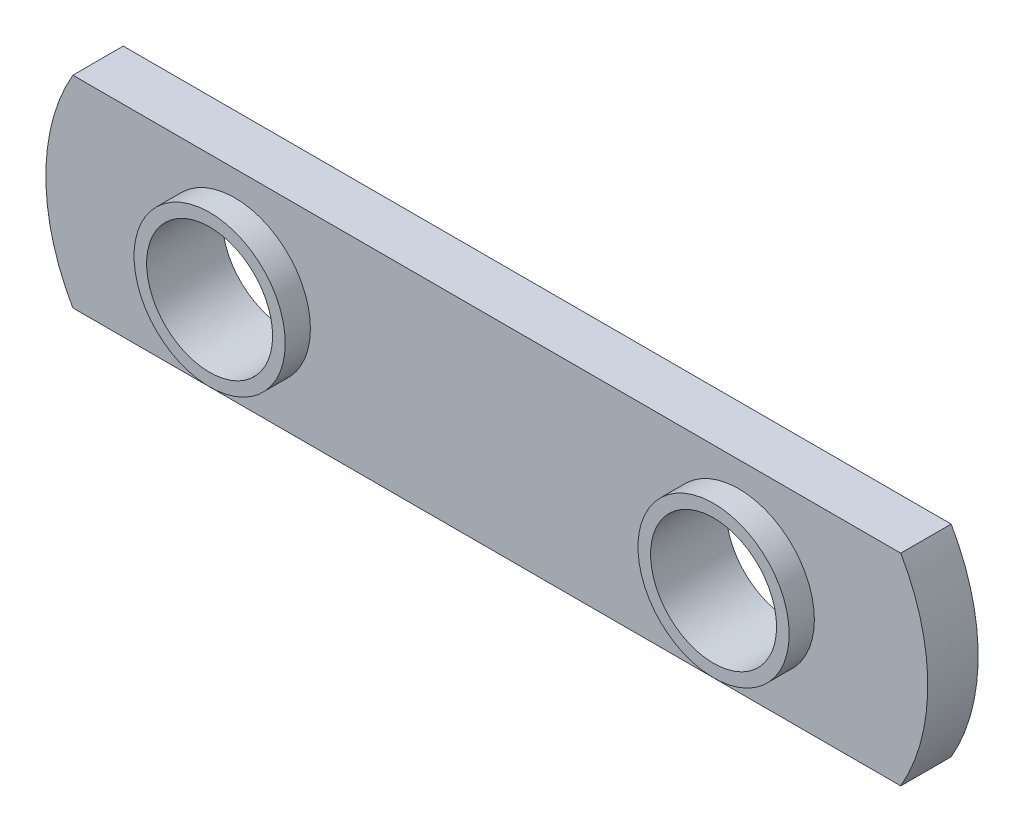
ISO-10303-21;
HEADER;
FILE_DESCRIPTION(('STEP AP214'),'2;1');
FILE_NAME('part.step','',(''),(''),'','','');
FILE_SCHEMA(('AUTOMOTIVE_DESIGN { 1 0 10303 214 1 1 1 1 }'));
ENDSEC;
DATA;
#1=APPLICATION_CONTEXT('core data for automotive mechanical design processes');
#2=APPLICATION_PROTOCOL_DEFINITION('international standard','automotive_design',2000,#1);
#3=PRODUCT_CONTEXT('',#1,'mechanical');
#4=PRODUCT('Part','Part','',(#3));
#5=PRODUCT_RELATED_PRODUCT_CATEGORY('part','',(#4));
#6=PRODUCT_DEFINITION_FORMATION('','',#4);
#7=PRODUCT_DEFINITION_CONTEXT('part definition',#1,'design');
#8=PRODUCT_DEFINITION('design','',#6,#7);
#9=PRODUCT_DEFINITION_SHAPE('','',#8);
#10=(LENGTH_UNIT() NAMED_UNIT(*) SI_UNIT(.MILLI.,.METRE.));
#11=(NAMED_UNIT(*) PLANE_ANGLE_UNIT() SI_UNIT($,.RADIAN.));
#12=(NAMED_UNIT(*) SI_UNIT($,.STERADIAN.) SOLID_ANGLE_UNIT());
#13=UNCERTAINTY_MEASURE_WITH_UNIT(LENGTH_MEASURE(1.E-05),#10,'distance_accuracy_value','');
#14=(GEOMETRIC_REPRESENTATION_CONTEXT(3) GLOBAL_UNCERTAINTY_ASSIGNED_CONTEXT((#13)) GLOBAL_UNIT_ASSIGNED_CONTEXT((#10,
#11,#12)) REPRESENTATION_CONTEXT('',''));
#15=CARTESIAN_POINT('',(0.,0.,0.));
#16=DIRECTION('',(0.,0.,1.));
#17=DIRECTION('',(1.,0.,0.));
#18=AXIS2_PLACEMENT_3D('',#15,#16,#17);
#19=CARTESIAN_POINT('',(13.,0.,1.5));
#20=DIRECTION('',(0.,0.,1.));
#21=DIRECTION('',(1.,0.,0.));
#22=AXIS2_PLACEMENT_3D('',#19,#20,#21);
#23=PLANE('',#22);
#24=CARTESIAN_POINT('',(10.,0.,1.5));
#25=DIRECTION('',(0.,0.,1.));
#26=DIRECTION('',(1.,0.,0.));
#27=AXIS2_PLACEMENT_3D('',#24,#25,#26);
#28=CIRCLE('',#27,2.5);
#29=CARTESIAN_POINT('',(12.5,0.,1.5));
#30=VERTEX_POINT('',#29);
#31=EDGE_CURVE('E57',#30,#30,#28,.T.);
#32=ORIENTED_EDGE('',*,*,#31,.F.);
#33=EDGE_LOOP('',(#32));
#34=FACE_BOUND('',#33,.T.);
#35=CARTESIAN_POINT('',(10.,0.,1.5));
#36=DIRECTION('',(0.,0.,1.));
#37=DIRECTION('',(1.,0.,0.));
#38=AXIS2_PLACEMENT_3D('',#35,#36,#37);
#39=CIRCLE('',#38,3.);
#40=CARTESIAN_POINT('',(13.,0.,1.5));
#41=VERTEX_POINT('',#40);
#42=EDGE_CURVE('E151',#41,#41,#39,.T.);
#43=ORIENTED_EDGE('',*,*,#42,.T.);
#44=EDGE_LOOP('',(#43));
#45=FACE_BOUND('',#44,.T.);
#46=ADVANCED_FACE('F47',(#34,#45),#23,.T.);
#47=CARTESIAN_POINT('',(3.5717967697245,4.00000000000002,-1.5));
#48=DIRECTION('',(0.,0.,-1.));
#49=DIRECTION('',(-1.,0.,0.));
#50=AXIS2_PLACEMENT_3D('',#47,#48,#49);
#51=PLANE('',#50);
#52=CARTESIAN_POINT('',(10.,0.,-1.5));
#53=DIRECTION('',(0.,0.,-1.));
#54=DIRECTION('',(-1.,0.,0.));
#55=AXIS2_PLACEMENT_3D('',#52,#53,#54);
#56=CIRCLE('',#55,2.5);
#57=CARTESIAN_POINT('',(7.50000000000001,0.,-1.5));
#58=VERTEX_POINT('',#57);
#59=EDGE_CURVE('E12',#58,#58,#56,.T.);
#60=ORIENTED_EDGE('',*,*,#59,.F.);
#61=EDGE_LOOP('',(#60));
#62=FACE_BOUND('',#61,.T.);
#63=CARTESIAN_POINT('',(-9.49999999999999,0.,-1.5));
#64=DIRECTION('',(0.,0.,1.));
#65=DIRECTION('',(1.,0.,0.));
#66=AXIS2_PLACEMENT_3D('',#63,#64,#65);
#67=CIRCLE('',#66,8.);
#68=CARTESIAN_POINT('',(-16.4282032302755,4.00000000000002,-1.5));
#69=VERTEX_POINT('',#68);
#70=CARTESIAN_POINT('',(-16.4282032302755,-3.99999999999999,-1.5));
#71=VERTEX_POINT('',#70);
#72=EDGE_CURVE('E120',#69,#71,#67,.T.);
#73=ORIENTED_EDGE('',*,*,#72,.F.);
#74=DIRECTION('',(-1.,0.,0.));
#75=VECTOR('',#74,1.);
#76=CARTESIAN_POINT('',(-16.4282032302755,4.00000000000002,-1.5));
#77=LINE('',#76,#75);
#78=CARTESIAN_POINT('',(16.4282032302755,4.00000000000002,-1.5));
#79=VERTEX_POINT('',#78);
#80=EDGE_CURVE('E88',#79,#69,#77,.T.);
#81=ORIENTED_EDGE('',*,*,#80,.F.);
#82=CARTESIAN_POINT('',(9.50000000000001,0.,-1.5));
#83=DIRECTION('',(0.,0.,1.));
#84=DIRECTION('',(-1.,0.,0.));
#85=AXIS2_PLACEMENT_3D('',#82,#83,#84);
#86=CIRCLE('',#85,8.);
#87=CARTESIAN_POINT('',(16.4282032302755,-3.99999999999999,-1.5));
#88=VERTEX_POINT('',#87);
#89=EDGE_CURVE('E82',#88,#79,#86,.T.);
#90=ORIENTED_EDGE('',*,*,#89,.F.);
#91=DIRECTION('',(1.,0.,0.));
#92=VECTOR('',#91,1.);
#93=CARTESIAN_POINT('',(16.4282032302755,-3.99999999999999,-1.5));
#94=LINE('',#93,#92);
#95=EDGE_CURVE('E107',#71,#88,#94,.T.);
#96=ORIENTED_EDGE('',*,*,#95,.F.);
#97=EDGE_LOOP('',(#73,#81,#90,#96));
#98=FACE_BOUND('',#97,.T.);
#99=CARTESIAN_POINT('',(-9.99999999999999,0.,-1.5));
#100=DIRECTION('',(0.,0.,1.));
#101=DIRECTION('',(1.,0.,0.));
#102=AXIS2_PLACEMENT_3D('',#99,#100,#101);
#103=CIRCLE('',#102,2.5);
#104=CARTESIAN_POINT('',(-7.49999999999999,0.,-1.5));
#105=VERTEX_POINT('',#104);
#106=EDGE_CURVE('E162',#105,#105,#103,.T.);
#107=ORIENTED_EDGE('',*,*,#106,.T.);
#108=EDGE_LOOP('',(#107));
#109=FACE_BOUND('',#108,.T.);
#110=ADVANCED_FACE('F49',(#62,#98,#109),#51,.T.);
#111=CARTESIAN_POINT('',(-6.99999999999999,0.,1.5));
#112=DIRECTION('',(0.,0.,1.));
#113=DIRECTION('',(1.,0.,0.));
#114=AXIS2_PLACEMENT_3D('',#111,#112,#113);
#115=PLANE('',#114);
#116=CARTESIAN_POINT('',(-9.99999999999999,0.,1.5));
#117=DIRECTION('',(0.,0.,1.));
#118=DIRECTION('',(1.,0.,0.));
#119=AXIS2_PLACEMENT_3D('',#116,#117,#118);
#120=CIRCLE('',#119,2.5);
#121=CARTESIAN_POINT('',(-7.49999999999999,0.,1.5));
#122=VERTEX_POINT('',#121);
#123=EDGE_CURVE('E137',#122,#122,#120,.T.);
#124=ORIENTED_EDGE('',*,*,#123,.F.);
#125=EDGE_LOOP('',(#124));
#126=FACE_BOUND('',#125,.T.);
#127=CARTESIAN_POINT('',(-9.99999999999999,0.,1.5));
#128=DIRECTION('',(0.,0.,1.));
#129=DIRECTION('',(1.,0.,0.));
#130=AXIS2_PLACEMENT_3D('',#127,#128,#129);
#131=CIRCLE('',#130,3.);
#132=CARTESIAN_POINT('',(-6.99999999999999,0.,1.5));
#133=VERTEX_POINT('',#132);
#134=EDGE_CURVE('E124',#133,#133,#131,.T.);
#135=ORIENTED_EDGE('',*,*,#134,.T.);
#136=EDGE_LOOP('',(#135));
#137=FACE_BOUND('',#136,.T.);
#138=ADVANCED_FACE('F148',(#126,#137),#115,.T.);
#139=CARTESIAN_POINT('',(-9.49999999999999,0.,0.5));
#140=DIRECTION('',(0.,0.,-1.));
#141=DIRECTION('',(-1.,0.,0.));
#142=AXIS2_PLACEMENT_3D('',#139,#140,#141);
#143=CYLINDRICAL_SURFACE('',#142,8.);
#144=ORIENTED_EDGE('',*,*,#72,.T.);
#145=DIRECTION('',(0.,0.,-1.));
#146=VECTOR('',#145,1.);
#147=CARTESIAN_POINT('',(-16.4282032302755,-3.99999999999999,0.5));
#148=LINE('',#147,#146);
#149=CARTESIAN_POINT('',(-16.4282032302755,-3.99999999999999,0.5));
#150=VERTEX_POINT('',#149);
#151=EDGE_CURVE('E109',#150,#71,#148,.T.);
#152=ORIENTED_EDGE('',*,*,#151,.F.);
#153=CARTESIAN_POINT('',(-9.49999999999999,0.,0.5));
#154=DIRECTION('',(0.,0.,1.));
#155=DIRECTION('',(1.,0.,0.));
#156=AXIS2_PLACEMENT_3D('',#153,#154,#155);
#157=CIRCLE('',#156,8.);
#158=CARTESIAN_POINT('',(-16.4282032302755,4.00000000000002,0.5));
#159=VERTEX_POINT('',#158);
#160=EDGE_CURVE('E101',#159,#150,#157,.T.);
#161=ORIENTED_EDGE('',*,*,#160,.F.);
#162=DIRECTION('',(0.,0.,-1.));
#163=VECTOR('',#162,1.);
#164=CARTESIAN_POINT('',(-16.4282032302755,4.00000000000002,0.5));
#165=LINE('',#164,#163);
#166=EDGE_CURVE('E116',#159,#69,#165,.T.);
#167=ORIENTED_EDGE('',*,*,#166,.T.);
#168=EDGE_LOOP('',(#144,#152,#161,#167));
#169=FACE_BOUND('',#168,.T.);
#170=ADVANCED_FACE('F193',(#169),#143,.T.);
#171=CARTESIAN_POINT('',(16.4282032302755,-3.99999999999999,0.5));
#172=DIRECTION('',(0.,1.,0.));
#173=DIRECTION('',(-1.,0.,0.));
#174=AXIS2_PLACEMENT_3D('',#171,#172,#173);
#175=PLANE('',#174);
#176=ORIENTED_EDGE('',*,*,#95,.T.);
#177=DIRECTION('',(0.,0.,-1.));
#178=VECTOR('',#177,1.);
#179=CARTESIAN_POINT('',(16.4282032302755,-3.99999999999999,0.5));
#180=LINE('',#179,#178);
#181=CARTESIAN_POINT('',(16.4282032302755,-3.99999999999999,0.5));
#182=VERTEX_POINT('',#181);
#183=EDGE_CURVE('E105',#182,#88,#180,.T.);
#184=ORIENTED_EDGE('',*,*,#183,.F.);
#185=DIRECTION('',(1.,0.,0.));
#186=VECTOR('',#185,1.);
#187=CARTESIAN_POINT('',(16.4282032302755,-3.99999999999999,0.5));
#188=LINE('',#187,#186);
#189=EDGE_CURVE('E96',#150,#182,#188,.T.);
#190=ORIENTED_EDGE('',*,*,#189,.F.);
#191=ORIENTED_EDGE('',*,*,#151,.T.);
#192=EDGE_LOOP('',(#176,#184,#190,#191));
#193=FACE_BOUND('',#192,.T.);
#194=ADVANCED_FACE('F106',(#193),#175,.F.);
#195=CARTESIAN_POINT('',(9.50000000000001,0.,0.5));
#196=DIRECTION('',(0.,0.,-1.));
#197=DIRECTION('',(-1.,0.,0.));
#198=AXIS2_PLACEMENT_3D('',#195,#196,#197);
#199=CYLINDRICAL_SURFACE('',#198,8.);
#200=ORIENTED_EDGE('',*,*,#89,.T.);
#201=DIRECTION('',(0.,0.,-1.));
#202=VECTOR('',#201,1.);
#203=CARTESIAN_POINT('',(16.4282032302755,4.00000000000002,0.5));
#204=LINE('',#203,#202);
#205=CARTESIAN_POINT('',(16.4282032302755,4.00000000000002,0.5));
#206=VERTEX_POINT('',#205);
#207=EDGE_CURVE('E110',#206,#79,#204,.T.);
#208=ORIENTED_EDGE('',*,*,#207,.F.);
#209=CARTESIAN_POINT('',(9.50000000000001,0.,0.5));
#210=DIRECTION('',(0.,0.,1.));
#211=DIRECTION('',(-1.,0.,0.));
#212=AXIS2_PLACEMENT_3D('',#209,#210,#211);
#213=CIRCLE('',#212,8.);
#214=EDGE_CURVE('E99',#182,#206,#213,.T.);
#215=ORIENTED_EDGE('',*,*,#214,.F.);
#216=ORIENTED_EDGE('',*,*,#183,.T.);
#217=EDGE_LOOP('',(#200,#208,#215,#216));
#218=FACE_BOUND('',#217,.T.);
#219=ADVANCED_FACE('F112',(#218),#199,.T.);
#220=CARTESIAN_POINT('',(-16.4282032302755,4.00000000000002,0.5));
#221=DIRECTION('',(0.,-1.,0.));
#222=DIRECTION('',(1.,0.,0.));
#223=AXIS2_PLACEMENT_3D('',#220,#221,#222);
#224=PLANE('',#223);
#225=ORIENTED_EDGE('',*,*,#80,.T.);
#226=ORIENTED_EDGE('',*,*,#166,.F.);
#227=DIRECTION('',(-1.,0.,0.));
#228=VECTOR('',#227,1.);
#229=CARTESIAN_POINT('',(-16.4282032302755,4.00000000000002,0.5));
#230=LINE('',#229,#228);
#231=EDGE_CURVE('E65',#206,#159,#230,.T.);
#232=ORIENTED_EDGE('',*,*,#231,.F.);
#233=ORIENTED_EDGE('',*,*,#207,.T.);
#234=EDGE_LOOP('',(#225,#226,#232,#233));
#235=FACE_BOUND('',#234,.T.);
#236=ADVANCED_FACE('F180',(#235),#224,.F.);
#237=CARTESIAN_POINT('',(-9.49999999999999,0.,0.5));
#238=DIRECTION('',(0.,0.,1.));
#239=DIRECTION('',(1.,0.,0.));
#240=AXIS2_PLACEMENT_3D('',#237,#238,#239);
#241=PLANE('',#240);
#242=CARTESIAN_POINT('',(10.,0.,0.5));
#243=DIRECTION('',(0.,0.,1.));
#244=DIRECTION('',(1.,0.,0.));
#245=AXIS2_PLACEMENT_3D('',#242,#243,#244);
#246=CIRCLE('',#245,3.);
#247=CARTESIAN_POINT('',(13.,0.,0.5));
#248=VERTEX_POINT('',#247);
#249=EDGE_CURVE('E155',#248,#248,#246,.T.);
#250=ORIENTED_EDGE('',*,*,#249,.F.);
#251=EDGE_LOOP('',(#250));
#252=FACE_BOUND('',#251,.T.);
#253=CARTESIAN_POINT('',(-9.99999999999999,0.,0.5));
#254=DIRECTION('',(0.,0.,1.));
#255=DIRECTION('',(1.,0.,0.));
#256=AXIS2_PLACEMENT_3D('',#253,#254,#255);
#257=CIRCLE('',#256,3.);
#258=CARTESIAN_POINT('',(-6.99999999999999,0.,0.5));
#259=VERTEX_POINT('',#258);
#260=EDGE_CURVE('E154',#259,#259,#257,.T.);
#261=ORIENTED_EDGE('',*,*,#260,.F.);
#262=EDGE_LOOP('',(#261));
#263=FACE_BOUND('',#262,.T.);
#264=ORIENTED_EDGE('',*,*,#160,.T.);
#265=ORIENTED_EDGE('',*,*,#189,.T.);
#266=ORIENTED_EDGE('',*,*,#214,.T.);
#267=ORIENTED_EDGE('',*,*,#231,.T.);
#268=EDGE_LOOP('',(#264,#265,#266,#267));
#269=FACE_BOUND('',#268,.T.);
#270=ADVANCED_FACE('F97',(#252,#263,#269),#241,.T.);
#271=CARTESIAN_POINT('',(-9.99999999999999,0.,1.5));
#272=DIRECTION('',(0.,0.,-1.));
#273=DIRECTION('',(-1.,0.,0.));
#274=AXIS2_PLACEMENT_3D('',#271,#272,#273);
#275=CYLINDRICAL_SURFACE('',#274,3.);
#276=ORIENTED_EDGE('',*,*,#134,.F.);
#277=EDGE_LOOP('',(#276));
#278=FACE_BOUND('',#277,.T.);
#279=ORIENTED_EDGE('',*,*,#260,.T.);
#280=EDGE_LOOP('',(#279));
#281=FACE_BOUND('',#280,.T.);
#282=ADVANCED_FACE('F172',(#278,#281),#275,.T.);
#283=CARTESIAN_POINT('',(10.,0.,1.5));
#284=DIRECTION('',(0.,0.,-1.));
#285=DIRECTION('',(-1.,0.,0.));
#286=AXIS2_PLACEMENT_3D('',#283,#284,#285);
#287=CYLINDRICAL_SURFACE('',#286,3.);
#288=ORIENTED_EDGE('',*,*,#42,.F.);
#289=EDGE_LOOP('',(#288));
#290=FACE_BOUND('',#289,.T.);
#291=ORIENTED_EDGE('',*,*,#249,.T.);
#292=EDGE_LOOP('',(#291));
#293=FACE_BOUND('',#292,.T.);
#294=ADVANCED_FACE('F175',(#290,#293),#287,.T.);
#295=CARTESIAN_POINT('',(10.,0.,-1.5));
#296=DIRECTION('',(0.,0.,1.));
#297=DIRECTION('',(1.,0.,0.));
#298=AXIS2_PLACEMENT_3D('',#295,#296,#297);
#299=CYLINDRICAL_SURFACE('',#298,2.5);
#300=ORIENTED_EDGE('',*,*,#59,.T.);
#301=EDGE_LOOP('',(#300));
#302=FACE_BOUND('',#301,.T.);
#303=ORIENTED_EDGE('',*,*,#31,.T.);
#304=EDGE_LOOP('',(#303));
#305=FACE_BOUND('',#304,.T.);
#306=ADVANCED_FACE('F144',(#302,#305),#299,.F.);
#307=CARTESIAN_POINT('',(-9.99999999999999,0.,-1.5));
#308=DIRECTION('',(0.,0.,1.));
#309=DIRECTION('',(1.,0.,0.));
#310=AXIS2_PLACEMENT_3D('',#307,#308,#309);
#311=CYLINDRICAL_SURFACE('',#310,2.5);
#312=ORIENTED_EDGE('',*,*,#106,.F.);
#313=EDGE_LOOP('',(#312));
#314=FACE_BOUND('',#313,.T.);
#315=ORIENTED_EDGE('',*,*,#123,.T.);
#316=EDGE_LOOP('',(#315));
#317=FACE_BOUND('',#316,.T.);
#318=ADVANCED_FACE('F204',(#314,#317),#311,.F.);
#319=CLOSED_SHELL('',(#46,#110,#138,#170,#194,#219,#236,#270,#282,#294,#306,#318));
#320=MANIFOLD_SOLID_BREP('B2',#319);
#321=ADVANCED_BREP_SHAPE_REPRESENTATION('',(#18,#320),#14);
#322=SHAPE_DEFINITION_REPRESENTATION(#9,#321);
ENDSEC;
END-ISO-10303-21;
